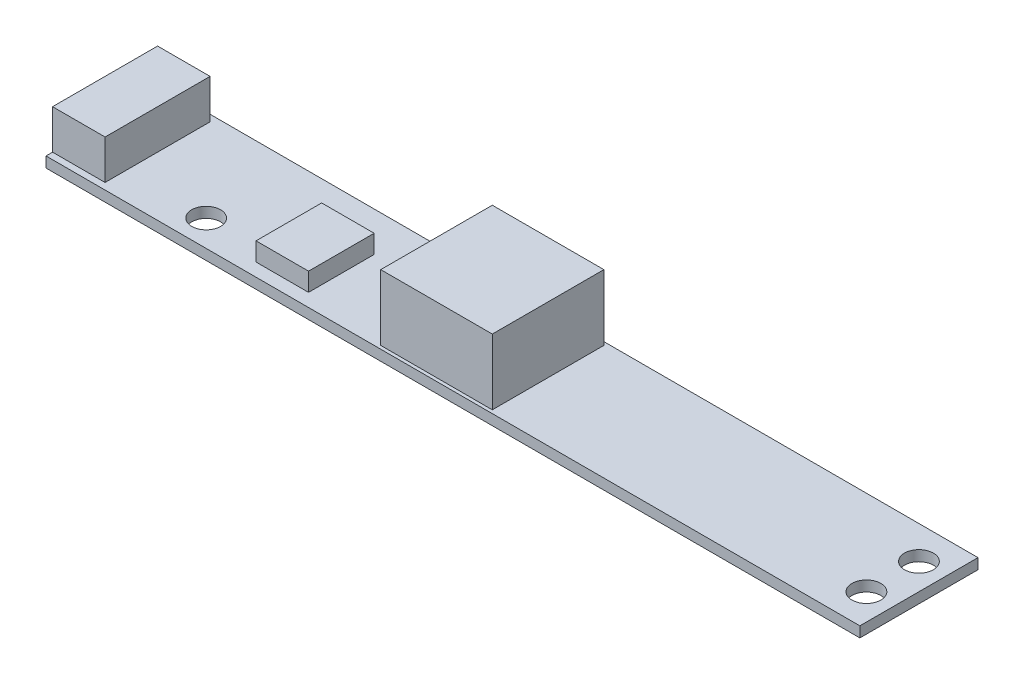
ISO-10303-21;
HEADER;
FILE_DESCRIPTION(('STEP AP214'),'2;1');
FILE_NAME('part.step','',(''),(''),'','','');
FILE_SCHEMA(('AUTOMOTIVE_DESIGN { 1 0 10303 214 1 1 1 1 }'));
ENDSEC;
DATA;
#1=APPLICATION_CONTEXT('core data for automotive mechanical design processes');
#2=APPLICATION_PROTOCOL_DEFINITION('international standard','automotive_design',2000,#1);
#3=PRODUCT_CONTEXT('',#1,'mechanical');
#4=PRODUCT('Part','Part','',(#3));
#5=PRODUCT_RELATED_PRODUCT_CATEGORY('part','',(#4));
#6=PRODUCT_DEFINITION_FORMATION('','',#4);
#7=PRODUCT_DEFINITION_CONTEXT('part definition',#1,'design');
#8=PRODUCT_DEFINITION('design','',#6,#7);
#9=PRODUCT_DEFINITION_SHAPE('','',#8);
#10=(LENGTH_UNIT() NAMED_UNIT(*) SI_UNIT(.MILLI.,.METRE.));
#11=(NAMED_UNIT(*) PLANE_ANGLE_UNIT() SI_UNIT($,.RADIAN.));
#12=(NAMED_UNIT(*) SI_UNIT($,.STERADIAN.) SOLID_ANGLE_UNIT());
#13=UNCERTAINTY_MEASURE_WITH_UNIT(LENGTH_MEASURE(1.E-05),#10,'distance_accuracy_value','');
#14=(GEOMETRIC_REPRESENTATION_CONTEXT(3) GLOBAL_UNCERTAINTY_ASSIGNED_CONTEXT((#13)) GLOBAL_UNIT_ASSIGNED_CONTEXT((#10,
#11,#12)) REPRESENTATION_CONTEXT('',''));
#15=CARTESIAN_POINT('',(0.,0.,0.));
#16=DIRECTION('',(0.,0.,1.));
#17=DIRECTION('',(1.,0.,0.));
#18=AXIS2_PLACEMENT_3D('',#15,#16,#17);
#19=CARTESIAN_POINT('',(0.,0.8,0.));
#20=DIRECTION('',(0.,-1.,0.));
#21=DIRECTION('',(0.,0.,-1.));
#22=AXIS2_PLACEMENT_3D('',#19,#20,#21);
#23=PLANE('',#22);
#24=DIRECTION('',(1.,0.,0.));
#25=VECTOR('',#24,1.);
#26=CARTESIAN_POINT('',(-27.,0.8,4.));
#27=LINE('',#26,#25);
#28=CARTESIAN_POINT('',(-31.,0.8,4.));
#29=VERTEX_POINT('',#28);
#30=CARTESIAN_POINT('',(-27.,0.8,4.));
#31=VERTEX_POINT('',#30);
#32=EDGE_CURVE('E175',#29,#31,#27,.T.);
#33=ORIENTED_EDGE('',*,*,#32,.F.);
#34=DIRECTION('',(0.,0.,1.));
#35=VECTOR('',#34,1.);
#36=CARTESIAN_POINT('',(-31.,0.8,4.5));
#37=LINE('',#36,#35);
#38=CARTESIAN_POINT('',(-31.,0.8,4.5));
#39=VERTEX_POINT('',#38);
#40=EDGE_CURVE('E269',#29,#39,#37,.T.);
#41=ORIENTED_EDGE('',*,*,#40,.T.);
#42=DIRECTION('',(1.,0.,0.));
#43=VECTOR('',#42,1.);
#44=CARTESIAN_POINT('',(-31.,0.8,4.5));
#45=LINE('',#44,#43);
#46=CARTESIAN_POINT('',(31.,0.8,4.5));
#47=VERTEX_POINT('',#46);
#48=EDGE_CURVE('E272',#39,#47,#45,.T.);
#49=ORIENTED_EDGE('',*,*,#48,.T.);
#50=DIRECTION('',(0.,0.,-1.));
#51=VECTOR('',#50,1.);
#52=CARTESIAN_POINT('',(31.,0.8,4.5));
#53=LINE('',#52,#51);
#54=CARTESIAN_POINT('',(31.,0.8,-4.5));
#55=VERTEX_POINT('',#54);
#56=EDGE_CURVE('E263',#47,#55,#53,.T.);
#57=ORIENTED_EDGE('',*,*,#56,.T.);
#58=DIRECTION('',(-1.,0.,0.));
#59=VECTOR('',#58,1.);
#60=CARTESIAN_POINT('',(-31.,0.8,-4.49999999999999));
#61=LINE('',#60,#59);
#62=CARTESIAN_POINT('',(-31.,0.8,-4.49999999999999));
#63=VERTEX_POINT('',#62);
#64=EDGE_CURVE('E266',#55,#63,#61,.T.);
#65=ORIENTED_EDGE('',*,*,#64,.T.);
#66=CARTESIAN_POINT('',(-31.,0.8,-4.));
#67=VERTEX_POINT('',#66);
#68=EDGE_CURVE('E270',#63,#67,#37,.T.);
#69=ORIENTED_EDGE('',*,*,#68,.T.);
#70=DIRECTION('',(-1.,0.,0.));
#71=VECTOR('',#70,1.);
#72=CARTESIAN_POINT('',(-31.,0.8,-4.));
#73=LINE('',#72,#71);
#74=CARTESIAN_POINT('',(-27.,0.8,-4.));
#75=VERTEX_POINT('',#74);
#76=EDGE_CURVE('E188',#75,#67,#73,.T.);
#77=ORIENTED_EDGE('',*,*,#76,.F.);
#78=DIRECTION('',(0.,0.,-1.));
#79=VECTOR('',#78,1.);
#80=CARTESIAN_POINT('',(-27.,0.8,-4.));
#81=LINE('',#80,#79);
#82=EDGE_CURVE('E178',#31,#75,#81,.T.);
#83=ORIENTED_EDGE('',*,*,#82,.F.);
#84=EDGE_LOOP('',(#33,#41,#49,#57,#65,#69,#77,#83));
#85=FACE_BOUND('',#84,.T.);
#86=CARTESIAN_POINT('',(-20.8,0.8,2.5));
#87=DIRECTION('',(0.,1.,0.));
#88=DIRECTION('',(0.,0.,1.));
#89=AXIS2_PLACEMENT_3D('',#86,#87,#88);
#90=CIRCLE('',#89,1.1);
#91=CARTESIAN_POINT('',(-20.8,0.8,3.6));
#92=VERTEX_POINT('',#91);
#93=EDGE_CURVE('E245',#92,#92,#90,.T.);
#94=ORIENTED_EDGE('',*,*,#93,.F.);
#95=EDGE_LOOP('',(#94));
#96=FACE_BOUND('',#95,.T.);
#97=CARTESIAN_POINT('',(29.,0.8,2.));
#98=DIRECTION('',(0.,1.,0.));
#99=DIRECTION('',(0.,0.,-1.));
#100=AXIS2_PLACEMENT_3D('',#97,#98,#99);
#101=CIRCLE('',#100,1.1);
#102=CARTESIAN_POINT('',(29.,0.8,0.899999999999998));
#103=VERTEX_POINT('',#102);
#104=EDGE_CURVE('E251',#103,#103,#101,.T.);
#105=ORIENTED_EDGE('',*,*,#104,.F.);
#106=EDGE_LOOP('',(#105));
#107=FACE_BOUND('',#106,.T.);
#108=CARTESIAN_POINT('',(29.,0.8,-2.));
#109=DIRECTION('',(0.,1.,0.));
#110=DIRECTION('',(0.,0.,1.));
#111=AXIS2_PLACEMENT_3D('',#108,#109,#110);
#112=CIRCLE('',#111,1.1);
#113=CARTESIAN_POINT('',(29.,0.8,-0.900000000000003));
#114=VERTEX_POINT('',#113);
#115=EDGE_CURVE('E257',#114,#114,#112,.T.);
#116=ORIENTED_EDGE('',*,*,#115,.F.);
#117=EDGE_LOOP('',(#116));
#118=FACE_BOUND('',#117,.T.);
#119=DIRECTION('',(0.,0.,-1.));
#120=VECTOR('',#119,1.);
#121=CARTESIAN_POINT('',(2.74999999999999,0.8,4.25));
#122=LINE('',#121,#120);
#123=CARTESIAN_POINT('',(2.74999999999999,0.8,4.25));
#124=VERTEX_POINT('',#123);
#125=CARTESIAN_POINT('',(2.74999999999999,0.8,-4.25));
#126=VERTEX_POINT('',#125);
#127=EDGE_CURVE('E211',#124,#126,#122,.T.);
#128=ORIENTED_EDGE('',*,*,#127,.F.);
#129=DIRECTION('',(1.,0.,0.));
#130=VECTOR('',#129,1.);
#131=CARTESIAN_POINT('',(-5.75000000000001,0.8,4.25));
#132=LINE('',#131,#130);
#133=CARTESIAN_POINT('',(-5.75000000000001,0.8,4.25));
#134=VERTEX_POINT('',#133);
#135=EDGE_CURVE('E216',#134,#124,#132,.T.);
#136=ORIENTED_EDGE('',*,*,#135,.F.);
#137=DIRECTION('',(0.,0.,1.));
#138=VECTOR('',#137,1.);
#139=CARTESIAN_POINT('',(-5.75000000000001,0.8,4.25));
#140=LINE('',#139,#138);
#141=CARTESIAN_POINT('',(-5.75000000000001,0.8,-4.25));
#142=VERTEX_POINT('',#141);
#143=EDGE_CURVE('E228',#142,#134,#140,.T.);
#144=ORIENTED_EDGE('',*,*,#143,.F.);
#145=DIRECTION('',(-1.,0.,0.));
#146=VECTOR('',#145,1.);
#147=CARTESIAN_POINT('',(-5.75000000000001,0.8,-4.25));
#148=LINE('',#147,#146);
#149=EDGE_CURVE('E225',#126,#142,#148,.T.);
#150=ORIENTED_EDGE('',*,*,#149,.F.);
#151=EDGE_LOOP('',(#128,#136,#144,#150));
#152=FACE_BOUND('',#151,.T.);
#153=DIRECTION('',(0.,0.,-1.));
#154=VECTOR('',#153,1.);
#155=CARTESIAN_POINT('',(-12.,0.8,3.5));
#156=LINE('',#155,#154);
#157=CARTESIAN_POINT('',(-12.,0.8,3.5));
#158=VERTEX_POINT('',#157);
#159=CARTESIAN_POINT('',(-12.,0.8,-1.5));
#160=VERTEX_POINT('',#159);
#161=EDGE_CURVE('E174',#158,#160,#156,.T.);
#162=ORIENTED_EDGE('',*,*,#161,.F.);
#163=DIRECTION('',(1.,0.,0.));
#164=VECTOR('',#163,1.);
#165=CARTESIAN_POINT('',(-16.,0.8,3.5));
#166=LINE('',#165,#164);
#167=CARTESIAN_POINT('',(-16.,0.8,3.5));
#168=VERTEX_POINT('',#167);
#169=EDGE_CURVE('E171',#168,#158,#166,.T.);
#170=ORIENTED_EDGE('',*,*,#169,.F.);
#171=DIRECTION('',(0.,0.,1.));
#172=VECTOR('',#171,1.);
#173=CARTESIAN_POINT('',(-16.,0.8,3.5));
#174=LINE('',#173,#172);
#175=CARTESIAN_POINT('',(-16.,0.8,-1.5));
#176=VERTEX_POINT('',#175);
#177=EDGE_CURVE('E61',#176,#168,#174,.T.);
#178=ORIENTED_EDGE('',*,*,#177,.F.);
#179=DIRECTION('',(-1.,0.,0.));
#180=VECTOR('',#179,1.);
#181=CARTESIAN_POINT('',(-16.,0.8,-1.5));
#182=LINE('',#181,#180);
#183=EDGE_CURVE('E56',#160,#176,#182,.T.);
#184=ORIENTED_EDGE('',*,*,#183,.F.);
#185=EDGE_LOOP('',(#162,#170,#178,#184));
#186=FACE_BOUND('',#185,.T.);
#187=ADVANCED_FACE('F41',(#85,#96,#107,#118,#152,#186),#23,.F.);
#188=CARTESIAN_POINT('',(0.,0.,0.));
#189=DIRECTION('',(0.,-1.,0.));
#190=DIRECTION('',(0.,0.,-1.));
#191=AXIS2_PLACEMENT_3D('',#188,#189,#190);
#192=PLANE('',#191);
#193=CARTESIAN_POINT('',(29.,0.,2.));
#194=DIRECTION('',(0.,1.,0.));
#195=DIRECTION('',(0.,0.,-1.));
#196=AXIS2_PLACEMENT_3D('',#193,#194,#195);
#197=CIRCLE('',#196,1.1);
#198=CARTESIAN_POINT('',(29.,0.,0.899999999999998));
#199=VERTEX_POINT('',#198);
#200=EDGE_CURVE('E248',#199,#199,#197,.T.);
#201=ORIENTED_EDGE('',*,*,#200,.T.);
#202=EDGE_LOOP('',(#201));
#203=FACE_BOUND('',#202,.T.);
#204=DIRECTION('',(0.,0.,-1.));
#205=VECTOR('',#204,1.);
#206=CARTESIAN_POINT('',(31.,0.,4.5));
#207=LINE('',#206,#205);
#208=CARTESIAN_POINT('',(31.,0.,4.5));
#209=VERTEX_POINT('',#208);
#210=CARTESIAN_POINT('',(31.,0.,-4.5));
#211=VERTEX_POINT('',#210);
#212=EDGE_CURVE('E260',#209,#211,#207,.T.);
#213=ORIENTED_EDGE('',*,*,#212,.F.);
#214=DIRECTION('',(1.,0.,0.));
#215=VECTOR('',#214,1.);
#216=CARTESIAN_POINT('',(-31.,0.,4.5));
#217=LINE('',#216,#215);
#218=CARTESIAN_POINT('',(-31.,0.,4.5));
#219=VERTEX_POINT('',#218);
#220=EDGE_CURVE('E267',#219,#209,#217,.T.);
#221=ORIENTED_EDGE('',*,*,#220,.F.);
#222=DIRECTION('',(0.,0.,1.));
#223=VECTOR('',#222,1.);
#224=CARTESIAN_POINT('',(-31.,0.,4.5));
#225=LINE('',#224,#223);
#226=CARTESIAN_POINT('',(-31.,0.,-4.49999999999999));
#227=VERTEX_POINT('',#226);
#228=EDGE_CURVE('E279',#227,#219,#225,.T.);
#229=ORIENTED_EDGE('',*,*,#228,.F.);
#230=DIRECTION('',(-1.,0.,0.));
#231=VECTOR('',#230,1.);
#232=CARTESIAN_POINT('',(-31.,0.,-4.49999999999999));
#233=LINE('',#232,#231);
#234=EDGE_CURVE('E277',#211,#227,#233,.T.);
#235=ORIENTED_EDGE('',*,*,#234,.F.);
#236=EDGE_LOOP('',(#213,#221,#229,#235));
#237=FACE_BOUND('',#236,.T.);
#238=CARTESIAN_POINT('',(29.,0.,-2.));
#239=DIRECTION('',(0.,1.,0.));
#240=DIRECTION('',(0.,0.,1.));
#241=AXIS2_PLACEMENT_3D('',#238,#239,#240);
#242=CIRCLE('',#241,1.1);
#243=CARTESIAN_POINT('',(29.,0.,-0.900000000000003));
#244=VERTEX_POINT('',#243);
#245=EDGE_CURVE('E254',#244,#244,#242,.T.);
#246=ORIENTED_EDGE('',*,*,#245,.T.);
#247=EDGE_LOOP('',(#246));
#248=FACE_BOUND('',#247,.T.);
#249=CARTESIAN_POINT('',(-20.8,0.,2.5));
#250=DIRECTION('',(0.,1.,0.));
#251=DIRECTION('',(0.,0.,1.));
#252=AXIS2_PLACEMENT_3D('',#249,#250,#251);
#253=CIRCLE('',#252,1.1);
#254=CARTESIAN_POINT('',(-20.8,0.,3.6));
#255=VERTEX_POINT('',#254);
#256=EDGE_CURVE('E244',#255,#255,#253,.T.);
#257=ORIENTED_EDGE('',*,*,#256,.T.);
#258=EDGE_LOOP('',(#257));
#259=FACE_BOUND('',#258,.T.);
#260=ADVANCED_FACE('F297',(#203,#237,#248,#259),#192,.T.);
#261=CARTESIAN_POINT('',(31.,0.8,4.5));
#262=DIRECTION('',(-1.,0.,0.));
#263=DIRECTION('',(0.,0.,1.));
#264=AXIS2_PLACEMENT_3D('',#261,#262,#263);
#265=PLANE('',#264);
#266=ORIENTED_EDGE('',*,*,#212,.T.);
#267=DIRECTION('',(0.,-1.,0.));
#268=VECTOR('',#267,1.);
#269=CARTESIAN_POINT('',(31.,0.8,-4.5));
#270=LINE('',#269,#268);
#271=EDGE_CURVE('E11',#55,#211,#270,.T.);
#272=ORIENTED_EDGE('',*,*,#271,.F.);
#273=ORIENTED_EDGE('',*,*,#56,.F.);
#274=DIRECTION('',(0.,-1.,0.));
#275=VECTOR('',#274,1.);
#276=CARTESIAN_POINT('',(31.,0.8,4.5));
#277=LINE('',#276,#275);
#278=EDGE_CURVE('E274',#47,#209,#277,.T.);
#279=ORIENTED_EDGE('',*,*,#278,.T.);
#280=EDGE_LOOP('',(#266,#272,#273,#279));
#281=FACE_BOUND('',#280,.T.);
#282=ADVANCED_FACE('F43',(#281),#265,.F.);
#283=CARTESIAN_POINT('',(-31.,0.8,-4.49999999999999));
#284=DIRECTION('',(0.,0.,1.));
#285=DIRECTION('',(1.,0.,0.));
#286=AXIS2_PLACEMENT_3D('',#283,#284,#285);
#287=PLANE('',#286);
#288=ORIENTED_EDGE('',*,*,#234,.T.);
#289=DIRECTION('',(0.,-1.,0.));
#290=VECTOR('',#289,1.);
#291=CARTESIAN_POINT('',(-31.,0.8,-4.49999999999999));
#292=LINE('',#291,#290);
#293=EDGE_CURVE('E49',#63,#227,#292,.T.);
#294=ORIENTED_EDGE('',*,*,#293,.F.);
#295=ORIENTED_EDGE('',*,*,#64,.F.);
#296=ORIENTED_EDGE('',*,*,#271,.T.);
#297=EDGE_LOOP('',(#288,#294,#295,#296));
#298=FACE_BOUND('',#297,.T.);
#299=ADVANCED_FACE('F348',(#298),#287,.F.);
#300=CARTESIAN_POINT('',(-31.,0.8,4.5));
#301=DIRECTION('',(1.,0.,0.));
#302=DIRECTION('',(0.,0.,-1.));
#303=AXIS2_PLACEMENT_3D('',#300,#301,#302);
#304=PLANE('',#303);
#305=ORIENTED_EDGE('',*,*,#228,.T.);
#306=DIRECTION('',(0.,-1.,0.));
#307=VECTOR('',#306,1.);
#308=CARTESIAN_POINT('',(-31.,0.8,4.5));
#309=LINE('',#308,#307);
#310=EDGE_CURVE('E284',#39,#219,#309,.T.);
#311=ORIENTED_EDGE('',*,*,#310,.F.);
#312=ORIENTED_EDGE('',*,*,#40,.F.);
#313=DIRECTION('',(0.,-1.,0.));
#314=VECTOR('',#313,1.);
#315=CARTESIAN_POINT('',(-31.,3.8,4.));
#316=LINE('',#315,#314);
#317=CARTESIAN_POINT('',(-31.,3.8,4.));
#318=VERTEX_POINT('',#317);
#319=EDGE_CURVE('E208',#318,#29,#316,.T.);
#320=ORIENTED_EDGE('',*,*,#319,.F.);
#321=DIRECTION('',(0.,0.,1.));
#322=VECTOR('',#321,1.);
#323=CARTESIAN_POINT('',(-31.,3.8,4.));
#324=LINE('',#323,#322);
#325=CARTESIAN_POINT('',(-31.,3.8,-4.));
#326=VERTEX_POINT('',#325);
#327=EDGE_CURVE('E184',#326,#318,#324,.T.);
#328=ORIENTED_EDGE('',*,*,#327,.F.);
#329=DIRECTION('',(0.,-1.,0.));
#330=VECTOR('',#329,1.);
#331=CARTESIAN_POINT('',(-31.,3.8,-4.));
#332=LINE('',#331,#330);
#333=EDGE_CURVE('E194',#326,#67,#332,.T.);
#334=ORIENTED_EDGE('',*,*,#333,.T.);
#335=ORIENTED_EDGE('',*,*,#68,.F.);
#336=ORIENTED_EDGE('',*,*,#293,.T.);
#337=EDGE_LOOP('',(#305,#311,#312,#320,#328,#334,#335,#336));
#338=FACE_BOUND('',#337,.T.);
#339=ADVANCED_FACE('F291',(#338),#304,.F.);
#340=CARTESIAN_POINT('',(-31.,0.8,4.5));
#341=DIRECTION('',(0.,0.,-1.));
#342=DIRECTION('',(-1.,0.,0.));
#343=AXIS2_PLACEMENT_3D('',#340,#341,#342);
#344=PLANE('',#343);
#345=ORIENTED_EDGE('',*,*,#220,.T.);
#346=ORIENTED_EDGE('',*,*,#278,.F.);
#347=ORIENTED_EDGE('',*,*,#48,.F.);
#348=ORIENTED_EDGE('',*,*,#310,.T.);
#349=EDGE_LOOP('',(#345,#346,#347,#348));
#350=FACE_BOUND('',#349,.T.);
#351=ADVANCED_FACE('F301',(#350),#344,.F.);
#352=CARTESIAN_POINT('',(29.,0.8,-2.));
#353=DIRECTION('',(0.,-1.,0.));
#354=DIRECTION('',(0.,0.,-1.));
#355=AXIS2_PLACEMENT_3D('',#352,#353,#354);
#356=CYLINDRICAL_SURFACE('',#355,1.1);
#357=ORIENTED_EDGE('',*,*,#115,.T.);
#358=EDGE_LOOP('',(#357));
#359=FACE_BOUND('',#358,.T.);
#360=ORIENTED_EDGE('',*,*,#245,.F.);
#361=EDGE_LOOP('',(#360));
#362=FACE_BOUND('',#361,.T.);
#363=ADVANCED_FACE('F342',(#359,#362),#356,.F.);
#364=CARTESIAN_POINT('',(29.,0.8,2.));
#365=DIRECTION('',(0.,-1.,0.));
#366=DIRECTION('',(0.,0.,-1.));
#367=AXIS2_PLACEMENT_3D('',#364,#365,#366);
#368=CYLINDRICAL_SURFACE('',#367,1.1);
#369=ORIENTED_EDGE('',*,*,#104,.T.);
#370=EDGE_LOOP('',(#369));
#371=FACE_BOUND('',#370,.T.);
#372=ORIENTED_EDGE('',*,*,#200,.F.);
#373=EDGE_LOOP('',(#372));
#374=FACE_BOUND('',#373,.T.);
#375=ADVANCED_FACE('F385',(#371,#374),#368,.F.);
#376=CARTESIAN_POINT('',(-20.8,0.8,2.5));
#377=DIRECTION('',(0.,-1.,0.));
#378=DIRECTION('',(0.,0.,-1.));
#379=AXIS2_PLACEMENT_3D('',#376,#377,#378);
#380=CYLINDRICAL_SURFACE('',#379,1.1);
#381=ORIENTED_EDGE('',*,*,#93,.T.);
#382=EDGE_LOOP('',(#381));
#383=FACE_BOUND('',#382,.T.);
#384=ORIENTED_EDGE('',*,*,#256,.F.);
#385=EDGE_LOOP('',(#384));
#386=FACE_BOUND('',#385,.T.);
#387=ADVANCED_FACE('F393',(#383,#386),#380,.F.);
#388=CARTESIAN_POINT('',(2.74999999999999,5.8,4.25));
#389=DIRECTION('',(-1.,0.,0.));
#390=DIRECTION('',(0.,0.,1.));
#391=AXIS2_PLACEMENT_3D('',#388,#389,#390);
#392=PLANE('',#391);
#393=ORIENTED_EDGE('',*,*,#127,.T.);
#394=DIRECTION('',(0.,-1.,0.));
#395=VECTOR('',#394,1.);
#396=CARTESIAN_POINT('',(2.74999999999999,5.8,-4.25));
#397=LINE('',#396,#395);
#398=CARTESIAN_POINT('',(2.74999999999999,5.8,-4.25));
#399=VERTEX_POINT('',#398);
#400=EDGE_CURVE('E241',#399,#126,#397,.T.);
#401=ORIENTED_EDGE('',*,*,#400,.F.);
#402=DIRECTION('',(0.,0.,-1.));
#403=VECTOR('',#402,1.);
#404=CARTESIAN_POINT('',(2.74999999999999,5.8,4.25));
#405=LINE('',#404,#403);
#406=CARTESIAN_POINT('',(2.74999999999999,5.8,4.25));
#407=VERTEX_POINT('',#406);
#408=EDGE_CURVE('E212',#407,#399,#405,.T.);
#409=ORIENTED_EDGE('',*,*,#408,.F.);
#410=DIRECTION('',(0.,-1.,0.));
#411=VECTOR('',#410,1.);
#412=CARTESIAN_POINT('',(2.74999999999999,5.8,4.25));
#413=LINE('',#412,#411);
#414=EDGE_CURVE('E222',#407,#124,#413,.T.);
#415=ORIENTED_EDGE('',*,*,#414,.T.);
#416=EDGE_LOOP('',(#393,#401,#409,#415));
#417=FACE_BOUND('',#416,.T.);
#418=ADVANCED_FACE('F401',(#417),#392,.F.);
#419=CARTESIAN_POINT('',(-5.75000000000001,5.8,-4.25));
#420=DIRECTION('',(0.,0.,1.));
#421=DIRECTION('',(1.,0.,0.));
#422=AXIS2_PLACEMENT_3D('',#419,#420,#421);
#423=PLANE('',#422);
#424=ORIENTED_EDGE('',*,*,#149,.T.);
#425=DIRECTION('',(0.,-1.,0.));
#426=VECTOR('',#425,1.);
#427=CARTESIAN_POINT('',(-5.75000000000001,5.8,-4.25));
#428=LINE('',#427,#426);
#429=CARTESIAN_POINT('',(-5.75000000000001,5.8,-4.25));
#430=VERTEX_POINT('',#429);
#431=EDGE_CURVE('E238',#430,#142,#428,.T.);
#432=ORIENTED_EDGE('',*,*,#431,.F.);
#433=DIRECTION('',(-1.,0.,0.));
#434=VECTOR('',#433,1.);
#435=CARTESIAN_POINT('',(-5.75000000000001,5.8,-4.25));
#436=LINE('',#435,#434);
#437=EDGE_CURVE('E215',#399,#430,#436,.T.);
#438=ORIENTED_EDGE('',*,*,#437,.F.);
#439=ORIENTED_EDGE('',*,*,#400,.T.);
#440=EDGE_LOOP('',(#424,#432,#438,#439));
#441=FACE_BOUND('',#440,.T.);
#442=ADVANCED_FACE('F410',(#441),#423,.F.);
#443=CARTESIAN_POINT('',(-5.75000000000001,5.8,4.25));
#444=DIRECTION('',(1.,0.,0.));
#445=DIRECTION('',(0.,0.,-1.));
#446=AXIS2_PLACEMENT_3D('',#443,#444,#445);
#447=PLANE('',#446);
#448=ORIENTED_EDGE('',*,*,#143,.T.);
#449=DIRECTION('',(0.,-1.,0.));
#450=VECTOR('',#449,1.);
#451=CARTESIAN_POINT('',(-5.75000000000001,5.8,4.25));
#452=LINE('',#451,#450);
#453=CARTESIAN_POINT('',(-5.75000000000001,5.8,4.25));
#454=VERTEX_POINT('',#453);
#455=EDGE_CURVE('E235',#454,#134,#452,.T.);
#456=ORIENTED_EDGE('',*,*,#455,.F.);
#457=DIRECTION('',(0.,0.,1.));
#458=VECTOR('',#457,1.);
#459=CARTESIAN_POINT('',(-5.75000000000001,5.8,4.25));
#460=LINE('',#459,#458);
#461=EDGE_CURVE('E218',#430,#454,#460,.T.);
#462=ORIENTED_EDGE('',*,*,#461,.F.);
#463=ORIENTED_EDGE('',*,*,#431,.T.);
#464=EDGE_LOOP('',(#448,#456,#462,#463));
#465=FACE_BOUND('',#464,.T.);
#466=ADVANCED_FACE('F419',(#465),#447,.F.);
#467=CARTESIAN_POINT('',(-5.75000000000001,5.8,4.25));
#468=DIRECTION('',(0.,0.,-1.));
#469=DIRECTION('',(-1.,0.,0.));
#470=AXIS2_PLACEMENT_3D('',#467,#468,#469);
#471=PLANE('',#470);
#472=ORIENTED_EDGE('',*,*,#135,.T.);
#473=ORIENTED_EDGE('',*,*,#414,.F.);
#474=DIRECTION('',(1.,0.,0.));
#475=VECTOR('',#474,1.);
#476=CARTESIAN_POINT('',(-5.75000000000001,5.8,4.25));
#477=LINE('',#476,#475);
#478=EDGE_CURVE('E220',#454,#407,#477,.T.);
#479=ORIENTED_EDGE('',*,*,#478,.F.);
#480=ORIENTED_EDGE('',*,*,#455,.T.);
#481=EDGE_LOOP('',(#472,#473,#479,#480));
#482=FACE_BOUND('',#481,.T.);
#483=ADVANCED_FACE('F428',(#482),#471,.F.);
#484=CARTESIAN_POINT('',(0.,5.8,0.));
#485=DIRECTION('',(0.,-1.,0.));
#486=DIRECTION('',(0.,0.,-1.));
#487=AXIS2_PLACEMENT_3D('',#484,#485,#486);
#488=PLANE('',#487);
#489=ORIENTED_EDGE('',*,*,#408,.T.);
#490=ORIENTED_EDGE('',*,*,#437,.T.);
#491=ORIENTED_EDGE('',*,*,#461,.T.);
#492=ORIENTED_EDGE('',*,*,#478,.T.);
#493=EDGE_LOOP('',(#489,#490,#491,#492));
#494=FACE_BOUND('',#493,.T.);
#495=ADVANCED_FACE('F330',(#494),#488,.F.);
#496=CARTESIAN_POINT('',(-27.,3.8,4.));
#497=DIRECTION('',(0.,0.,-1.));
#498=DIRECTION('',(-1.,0.,0.));
#499=AXIS2_PLACEMENT_3D('',#496,#497,#498);
#500=PLANE('',#499);
#501=ORIENTED_EDGE('',*,*,#32,.T.);
#502=DIRECTION('',(0.,-1.,0.));
#503=VECTOR('',#502,1.);
#504=CARTESIAN_POINT('',(-27.,3.8,4.));
#505=LINE('',#504,#503);
#506=CARTESIAN_POINT('',(-27.,3.8,4.));
#507=VERTEX_POINT('',#506);
#508=EDGE_CURVE('E205',#507,#31,#505,.T.);
#509=ORIENTED_EDGE('',*,*,#508,.F.);
#510=DIRECTION('',(1.,0.,0.));
#511=VECTOR('',#510,1.);
#512=CARTESIAN_POINT('',(-27.,3.8,4.));
#513=LINE('',#512,#511);
#514=EDGE_CURVE('E187',#318,#507,#513,.T.);
#515=ORIENTED_EDGE('',*,*,#514,.F.);
#516=ORIENTED_EDGE('',*,*,#319,.T.);
#517=EDGE_LOOP('',(#501,#509,#515,#516));
#518=FACE_BOUND('',#517,.T.);
#519=ADVANCED_FACE('F311',(#518),#500,.F.);
#520=CARTESIAN_POINT('',(-27.,3.8,-4.));
#521=DIRECTION('',(-1.,0.,0.));
#522=DIRECTION('',(0.,0.,1.));
#523=AXIS2_PLACEMENT_3D('',#520,#521,#522);
#524=PLANE('',#523);
#525=ORIENTED_EDGE('',*,*,#82,.T.);
#526=DIRECTION('',(0.,-1.,0.));
#527=VECTOR('',#526,1.);
#528=CARTESIAN_POINT('',(-27.,3.8,-4.));
#529=LINE('',#528,#527);
#530=CARTESIAN_POINT('',(-27.,3.8,-4.));
#531=VERTEX_POINT('',#530);
#532=EDGE_CURVE('E202',#531,#75,#529,.T.);
#533=ORIENTED_EDGE('',*,*,#532,.F.);
#534=DIRECTION('',(0.,0.,-1.));
#535=VECTOR('',#534,1.);
#536=CARTESIAN_POINT('',(-27.,3.8,1.22221666782824));
#537=LINE('',#536,#535);
#538=EDGE_CURVE('E190',#507,#531,#537,.T.);
#539=ORIENTED_EDGE('',*,*,#538,.F.);
#540=ORIENTED_EDGE('',*,*,#508,.T.);
#541=EDGE_LOOP('',(#525,#533,#539,#540));
#542=FACE_BOUND('',#541,.T.);
#543=ADVANCED_FACE('F322',(#542),#524,.F.);
#544=CARTESIAN_POINT('',(-31.,3.8,-4.));
#545=DIRECTION('',(0.,0.,1.));
#546=DIRECTION('',(1.,0.,0.));
#547=AXIS2_PLACEMENT_3D('',#544,#545,#546);
#548=PLANE('',#547);
#549=ORIENTED_EDGE('',*,*,#76,.T.);
#550=ORIENTED_EDGE('',*,*,#333,.F.);
#551=DIRECTION('',(-1.,0.,0.));
#552=VECTOR('',#551,1.);
#553=CARTESIAN_POINT('',(-31.,3.8,-4.));
#554=LINE('',#553,#552);
#555=EDGE_CURVE('E192',#531,#326,#554,.T.);
#556=ORIENTED_EDGE('',*,*,#555,.F.);
#557=ORIENTED_EDGE('',*,*,#532,.T.);
#558=EDGE_LOOP('',(#549,#550,#556,#557));
#559=FACE_BOUND('',#558,.T.);
#560=ADVANCED_FACE('F320',(#559),#548,.F.);
#561=CARTESIAN_POINT('',(0.,3.8,0.));
#562=DIRECTION('',(0.,-1.,0.));
#563=DIRECTION('',(0.,0.,-1.));
#564=AXIS2_PLACEMENT_3D('',#561,#562,#563);
#565=PLANE('',#564);
#566=ORIENTED_EDGE('',*,*,#327,.T.);
#567=ORIENTED_EDGE('',*,*,#514,.T.);
#568=ORIENTED_EDGE('',*,*,#538,.T.);
#569=ORIENTED_EDGE('',*,*,#555,.T.);
#570=EDGE_LOOP('',(#566,#567,#568,#569));
#571=FACE_BOUND('',#570,.T.);
#572=ADVANCED_FACE('F315',(#571),#565,.F.);
#573=CARTESIAN_POINT('',(-12.,2.2,3.5));
#574=DIRECTION('',(-1.,0.,0.));
#575=DIRECTION('',(0.,0.,1.));
#576=AXIS2_PLACEMENT_3D('',#573,#574,#575);
#577=PLANE('',#576);
#578=ORIENTED_EDGE('',*,*,#161,.T.);
#579=DIRECTION('',(0.,-1.,0.));
#580=VECTOR('',#579,1.);
#581=CARTESIAN_POINT('',(-12.,2.2,-1.5));
#582=LINE('',#581,#580);
#583=CARTESIAN_POINT('',(-12.,2.2,-1.5));
#584=VERTEX_POINT('',#583);
#585=EDGE_CURVE('E155',#584,#160,#582,.T.);
#586=ORIENTED_EDGE('',*,*,#585,.F.);
#587=DIRECTION('',(0.,0.,-1.));
#588=VECTOR('',#587,1.);
#589=CARTESIAN_POINT('',(-12.,2.2,3.5));
#590=LINE('',#589,#588);
#591=CARTESIAN_POINT('',(-12.,2.2,3.5));
#592=VERTEX_POINT('',#591);
#593=EDGE_CURVE('E162',#592,#584,#590,.T.);
#594=ORIENTED_EDGE('',*,*,#593,.F.);
#595=DIRECTION('',(0.,-1.,0.));
#596=VECTOR('',#595,1.);
#597=CARTESIAN_POINT('',(-12.,2.2,3.5));
#598=LINE('',#597,#596);
#599=EDGE_CURVE('E519',#592,#158,#598,.T.);
#600=ORIENTED_EDGE('',*,*,#599,.T.);
#601=EDGE_LOOP('',(#578,#586,#594,#600));
#602=FACE_BOUND('',#601,.T.);
#603=ADVANCED_FACE('F173',(#602),#577,.F.);
#604=CARTESIAN_POINT('',(-16.,2.2,-1.5));
#605=DIRECTION('',(0.,0.,1.));
#606=DIRECTION('',(1.,0.,0.));
#607=AXIS2_PLACEMENT_3D('',#604,#605,#606);
#608=PLANE('',#607);
#609=ORIENTED_EDGE('',*,*,#183,.T.);
#610=DIRECTION('',(0.,-1.,0.));
#611=VECTOR('',#610,1.);
#612=CARTESIAN_POINT('',(-16.,2.2,-1.5));
#613=LINE('',#612,#611);
#614=CARTESIAN_POINT('',(-16.,2.2,-1.5));
#615=VERTEX_POINT('',#614);
#616=EDGE_CURVE('E158',#615,#176,#613,.T.);
#617=ORIENTED_EDGE('',*,*,#616,.F.);
#618=DIRECTION('',(-1.,0.,0.));
#619=VECTOR('',#618,1.);
#620=CARTESIAN_POINT('',(-16.,2.2,-1.5));
#621=LINE('',#620,#619);
#622=EDGE_CURVE('E151',#584,#615,#621,.T.);
#623=ORIENTED_EDGE('',*,*,#622,.F.);
#624=ORIENTED_EDGE('',*,*,#585,.T.);
#625=EDGE_LOOP('',(#609,#617,#623,#624));
#626=FACE_BOUND('',#625,.T.);
#627=ADVANCED_FACE('F153',(#626),#608,.F.);
#628=CARTESIAN_POINT('',(-16.,2.2,3.5));
#629=DIRECTION('',(1.,0.,0.));
#630=DIRECTION('',(0.,0.,-1.));
#631=AXIS2_PLACEMENT_3D('',#628,#629,#630);
#632=PLANE('',#631);
#633=ORIENTED_EDGE('',*,*,#177,.T.);
#634=DIRECTION('',(0.,-1.,0.));
#635=VECTOR('',#634,1.);
#636=CARTESIAN_POINT('',(-16.,2.2,3.5));
#637=LINE('',#636,#635);
#638=CARTESIAN_POINT('',(-16.,2.2,3.5));
#639=VERTEX_POINT('',#638);
#640=EDGE_CURVE('E180',#639,#168,#637,.T.);
#641=ORIENTED_EDGE('',*,*,#640,.F.);
#642=DIRECTION('',(0.,0.,1.));
#643=VECTOR('',#642,1.);
#644=CARTESIAN_POINT('',(-16.,2.2,3.5));
#645=LINE('',#644,#643);
#646=EDGE_CURVE('E161',#615,#639,#645,.T.);
#647=ORIENTED_EDGE('',*,*,#646,.F.);
#648=ORIENTED_EDGE('',*,*,#616,.T.);
#649=EDGE_LOOP('',(#633,#641,#647,#648));
#650=FACE_BOUND('',#649,.T.);
#651=ADVANCED_FACE('F485',(#650),#632,.F.);
#652=CARTESIAN_POINT('',(-16.,2.2,3.5));
#653=DIRECTION('',(0.,0.,-1.));
#654=DIRECTION('',(-1.,0.,0.));
#655=AXIS2_PLACEMENT_3D('',#652,#653,#654);
#656=PLANE('',#655);
#657=ORIENTED_EDGE('',*,*,#169,.T.);
#658=ORIENTED_EDGE('',*,*,#599,.F.);
#659=DIRECTION('',(1.,0.,0.));
#660=VECTOR('',#659,1.);
#661=CARTESIAN_POINT('',(-16.,2.2,3.5));
#662=LINE('',#661,#660);
#663=EDGE_CURVE('E167',#639,#592,#662,.T.);
#664=ORIENTED_EDGE('',*,*,#663,.F.);
#665=ORIENTED_EDGE('',*,*,#640,.T.);
#666=EDGE_LOOP('',(#657,#658,#664,#665));
#667=FACE_BOUND('',#666,.T.);
#668=ADVANCED_FACE('F493',(#667),#656,.F.);
#669=CARTESIAN_POINT('',(0.,2.2,0.));
#670=DIRECTION('',(0.,-1.,0.));
#671=DIRECTION('',(0.,0.,-1.));
#672=AXIS2_PLACEMENT_3D('',#669,#670,#671);
#673=PLANE('',#672);
#674=ORIENTED_EDGE('',*,*,#593,.T.);
#675=ORIENTED_EDGE('',*,*,#622,.T.);
#676=ORIENTED_EDGE('',*,*,#646,.T.);
#677=ORIENTED_EDGE('',*,*,#663,.T.);
#678=EDGE_LOOP('',(#674,#675,#676,#677));
#679=FACE_BOUND('',#678,.T.);
#680=ADVANCED_FACE('F165',(#679),#673,.F.);
#681=CLOSED_SHELL('',(#187,#260,#282,#299,#339,#351,#363,#375,#387,#418,#442,#466,#483,#495,
#519,#543,#560,#572,#603,#627,#651,#668,#680));
#682=MANIFOLD_SOLID_BREP('B2',#681);
#683=ADVANCED_BREP_SHAPE_REPRESENTATION('',(#18,#682),#14);
#684=SHAPE_DEFINITION_REPRESENTATION(#9,#683);
ENDSEC;
END-ISO-10303-21;
